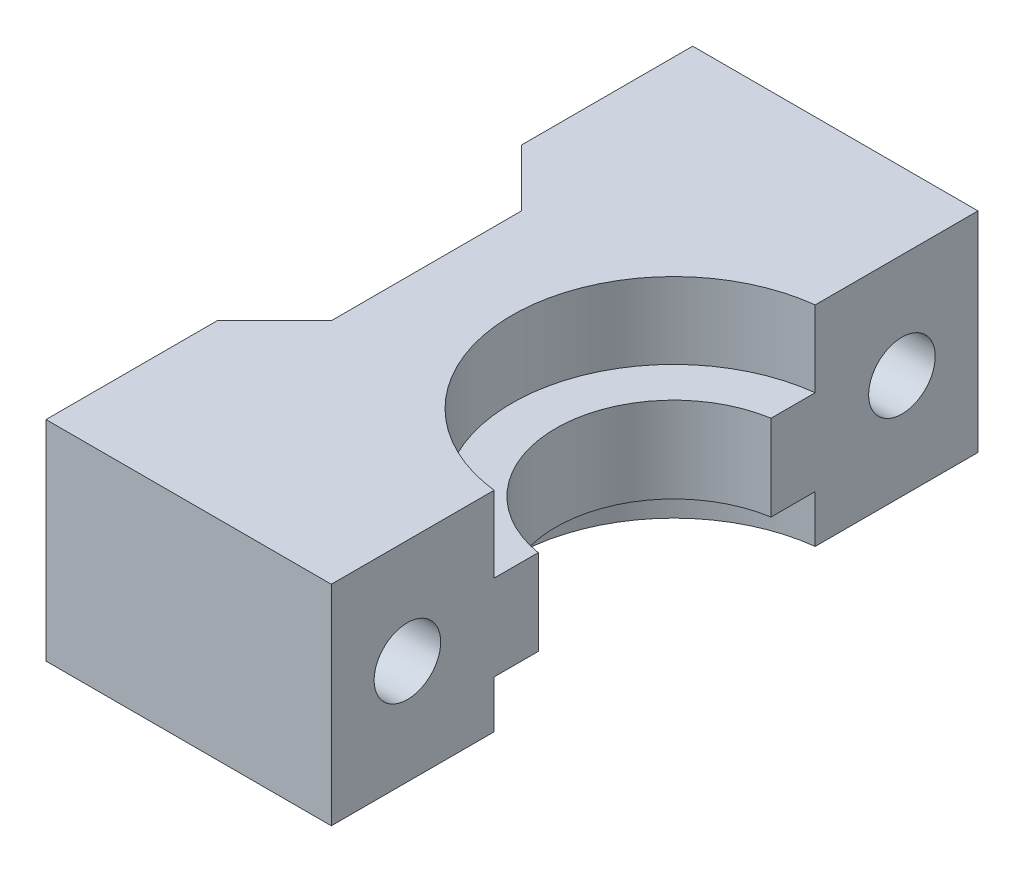
ISO-10303-21;
HEADER;
FILE_DESCRIPTION(('STEP AP214'),'2;1');
FILE_NAME('part.step','',(''),(''),'','','');
FILE_SCHEMA(('AUTOMOTIVE_DESIGN { 1 0 10303 214 1 1 1 1 }'));
ENDSEC;
DATA;
#1=APPLICATION_CONTEXT('core data for automotive mechanical design processes');
#2=APPLICATION_PROTOCOL_DEFINITION('international standard','automotive_design',2000,#1);
#3=PRODUCT_CONTEXT('',#1,'mechanical');
#4=PRODUCT('Part','Part','',(#3));
#5=PRODUCT_RELATED_PRODUCT_CATEGORY('part','',(#4));
#6=PRODUCT_DEFINITION_FORMATION('','',#4);
#7=PRODUCT_DEFINITION_CONTEXT('part definition',#1,'design');
#8=PRODUCT_DEFINITION('design','',#6,#7);
#9=PRODUCT_DEFINITION_SHAPE('','',#8);
#10=(LENGTH_UNIT() NAMED_UNIT(*) SI_UNIT(.MILLI.,.METRE.));
#11=(NAMED_UNIT(*) PLANE_ANGLE_UNIT() SI_UNIT($,.RADIAN.));
#12=(NAMED_UNIT(*) SI_UNIT($,.STERADIAN.) SOLID_ANGLE_UNIT());
#13=UNCERTAINTY_MEASURE_WITH_UNIT(LENGTH_MEASURE(1.E-05),#10,'distance_accuracy_value','');
#14=(GEOMETRIC_REPRESENTATION_CONTEXT(3) GLOBAL_UNCERTAINTY_ASSIGNED_CONTEXT((#13)) GLOBAL_UNIT_ASSIGNED_CONTEXT((#10,
#11,#12)) REPRESENTATION_CONTEXT('',''));
#15=CARTESIAN_POINT('',(0.,0.,0.));
#16=DIRECTION('',(0.,0.,1.));
#17=DIRECTION('',(1.,0.,0.));
#18=AXIS2_PLACEMENT_3D('',#15,#16,#17);
#19=CARTESIAN_POINT('',(-16.,0.,0.));
#20=DIRECTION('',(1.,0.,0.));
#21=DIRECTION('',(0.,0.,-1.));
#22=AXIS2_PLACEMENT_3D('',#19,#20,#21);
#23=PLANE('',#22);
#24=CARTESIAN_POINT('',(-16.,5.50000000000001,4.));
#25=DIRECTION('',(1.,0.,0.));
#26=DIRECTION('',(0.,0.,-1.));
#27=AXIS2_PLACEMENT_3D('',#24,#25,#26);
#28=CIRCLE('',#27,1.75);
#29=CARTESIAN_POINT('',(-16.,5.50000000000001,2.25));
#30=VERTEX_POINT('',#29);
#31=EDGE_CURVE('E221',#30,#30,#28,.T.);
#32=ORIENTED_EDGE('',*,*,#31,.T.);
#33=EDGE_LOOP('',(#32));
#34=FACE_BOUND('',#33,.T.);
#35=DIRECTION('',(0.,0.,-1.));
#36=VECTOR('',#35,1.);
#37=CARTESIAN_POINT('',(-16.,0.,34.));
#38=LINE('',#37,#36);
#39=CARTESIAN_POINT('',(-16.,0.,9.00000000000001));
#40=VERTEX_POINT('',#39);
#41=CARTESIAN_POINT('',(-16.,0.,0.));
#42=VERTEX_POINT('',#41);
#43=EDGE_CURVE('E230',#40,#42,#38,.T.);
#44=ORIENTED_EDGE('',*,*,#43,.F.);
#45=DIRECTION('',(0.,1.,0.));
#46=VECTOR('',#45,1.);
#47=CARTESIAN_POINT('',(-16.,0.,9.00000000000001));
#48=LINE('',#47,#46);
#49=CARTESIAN_POINT('',(-16.,11.,9.00000000000001));
#50=VERTEX_POINT('',#49);
#51=EDGE_CURVE('E13',#40,#50,#48,.T.);
#52=ORIENTED_EDGE('',*,*,#51,.T.);
#53=DIRECTION('',(0.,0.,1.));
#54=VECTOR('',#53,1.);
#55=CARTESIAN_POINT('',(-16.,11.,34.));
#56=LINE('',#55,#54);
#57=CARTESIAN_POINT('',(-16.,11.,0.));
#58=VERTEX_POINT('',#57);
#59=EDGE_CURVE('E236',#58,#50,#56,.T.);
#60=ORIENTED_EDGE('',*,*,#59,.F.);
#61=DIRECTION('',(0.,1.,0.));
#62=VECTOR('',#61,1.);
#63=CARTESIAN_POINT('',(-16.,11.,0.));
#64=LINE('',#63,#62);
#65=EDGE_CURVE('E232',#42,#58,#64,.T.);
#66=ORIENTED_EDGE('',*,*,#65,.F.);
#67=EDGE_LOOP('',(#44,#52,#60,#66));
#68=FACE_BOUND('',#67,.T.);
#69=ADVANCED_FACE('F47',(#34,#68),#23,.F.);
#70=CARTESIAN_POINT('',(-16.,11.,34.));
#71=DIRECTION('',(0.,0.,1.));
#72=DIRECTION('',(1.,0.,0.));
#73=AXIS2_PLACEMENT_3D('',#70,#71,#72);
#74=PLANE('',#73);
#75=DIRECTION('',(0.,1.,0.));
#76=VECTOR('',#75,1.);
#77=CARTESIAN_POINT('',(-0.999999999999997,0.,34.));
#78=LINE('',#77,#76);
#79=CARTESIAN_POINT('',(-0.999999999999997,0.,34.));
#80=VERTEX_POINT('',#79);
#81=CARTESIAN_POINT('',(-0.999999999999997,11.,34.));
#82=VERTEX_POINT('',#81);
#83=EDGE_CURVE('E179',#80,#82,#78,.T.);
#84=ORIENTED_EDGE('',*,*,#83,.T.);
#85=DIRECTION('',(1.,0.,0.));
#86=VECTOR('',#85,1.);
#87=CARTESIAN_POINT('',(-16.,11.,34.));
#88=LINE('',#87,#86);
#89=CARTESIAN_POINT('',(-16.,11.,34.));
#90=VERTEX_POINT('',#89);
#91=EDGE_CURVE('E240',#90,#82,#88,.T.);
#92=ORIENTED_EDGE('',*,*,#91,.F.);
#93=DIRECTION('',(0.,-1.,0.));
#94=VECTOR('',#93,1.);
#95=CARTESIAN_POINT('',(-16.,11.,34.));
#96=LINE('',#95,#94);
#97=CARTESIAN_POINT('',(-16.,0.,34.));
#98=VERTEX_POINT('',#97);
#99=EDGE_CURVE('E227',#90,#98,#96,.T.);
#100=ORIENTED_EDGE('',*,*,#99,.T.);
#101=DIRECTION('',(1.,0.,0.));
#102=VECTOR('',#101,1.);
#103=CARTESIAN_POINT('',(-16.,0.,34.));
#104=LINE('',#103,#102);
#105=EDGE_CURVE('E239',#98,#80,#104,.T.);
#106=ORIENTED_EDGE('',*,*,#105,.T.);
#107=EDGE_LOOP('',(#84,#92,#100,#106));
#108=FACE_BOUND('',#107,.T.);
#109=ADVANCED_FACE('F265',(#108),#74,.T.);
#110=CARTESIAN_POINT('',(-16.,11.,34.));
#111=DIRECTION('',(0.,1.,0.));
#112=DIRECTION('',(0.,0.,1.));
#113=AXIS2_PLACEMENT_3D('',#110,#111,#112);
#114=PLANE('',#113);
#115=DIRECTION('',(0.,0.,-1.));
#116=VECTOR('',#115,1.);
#117=CARTESIAN_POINT('',(-13.,11.,12.));
#118=LINE('',#117,#116);
#119=CARTESIAN_POINT('',(-13.,11.,22.));
#120=VERTEX_POINT('',#119);
#121=CARTESIAN_POINT('',(-13.,11.,12.));
#122=VERTEX_POINT('',#121);
#123=EDGE_CURVE('E163',#120,#122,#118,.T.);
#124=ORIENTED_EDGE('',*,*,#123,.F.);
#125=DIRECTION('',(0.707106781186546,0.,-0.707106781186549));
#126=VECTOR('',#125,1.);
#127=CARTESIAN_POINT('',(-20.5,11.,29.5));
#128=LINE('',#127,#126);
#129=CARTESIAN_POINT('',(-16.,11.,25.));
#130=VERTEX_POINT('',#129);
#131=EDGE_CURVE('E166',#120,#130,#128,.F.);
#132=ORIENTED_EDGE('',*,*,#131,.T.);
#133=EDGE_CURVE('E235',#130,#90,#56,.T.);
#134=ORIENTED_EDGE('',*,*,#133,.T.);
#135=ORIENTED_EDGE('',*,*,#91,.T.);
#136=DIRECTION('',(0.,0.,1.));
#137=VECTOR('',#136,1.);
#138=CARTESIAN_POINT('',(-1.,11.,0.));
#139=LINE('',#138,#137);
#140=CARTESIAN_POINT('',(-0.999999999999998,11.,25.4409715080671));
#141=VERTEX_POINT('',#140);
#142=EDGE_CURVE('E168',#141,#82,#139,.T.);
#143=ORIENTED_EDGE('',*,*,#142,.F.);
#144=CARTESIAN_POINT('',(0.,11.,17.));
#145=DIRECTION('',(0.,-1.,0.));
#146=DIRECTION('',(0.,0.,-1.));
#147=AXIS2_PLACEMENT_3D('',#144,#145,#146);
#148=CIRCLE('',#147,8.5);
#149=CARTESIAN_POINT('',(-1.,11.,8.55902849193294));
#150=VERTEX_POINT('',#149);
#151=EDGE_CURVE('E203',#141,#150,#148,.T.);
#152=ORIENTED_EDGE('',*,*,#151,.T.);
#153=CARTESIAN_POINT('',(-1.,11.,0.));
#154=VERTEX_POINT('',#153);
#155=EDGE_CURVE('E177',#154,#150,#139,.T.);
#156=ORIENTED_EDGE('',*,*,#155,.F.);
#157=DIRECTION('',(1.,0.,0.));
#158=VECTOR('',#157,1.);
#159=CARTESIAN_POINT('',(-16.,11.,0.));
#160=LINE('',#159,#158);
#161=EDGE_CURVE('E244',#58,#154,#160,.T.);
#162=ORIENTED_EDGE('',*,*,#161,.F.);
#163=ORIENTED_EDGE('',*,*,#59,.T.);
#164=DIRECTION('',(-0.707106781186549,0.,-0.707106781186546));
#165=VECTOR('',#164,1.);
#166=CARTESIAN_POINT('',(-3.5,11.,21.5));
#167=LINE('',#166,#165);
#168=EDGE_CURVE('E255',#50,#122,#167,.F.);
#169=ORIENTED_EDGE('',*,*,#168,.T.);
#170=EDGE_LOOP('',(#124,#132,#134,#135,#143,#152,#156,#162,#163,#169));
#171=FACE_BOUND('',#170,.T.);
#172=ADVANCED_FACE('F260',(#171),#114,.T.);
#173=CARTESIAN_POINT('',(-16.,11.,0.));
#174=DIRECTION('',(0.,0.,-1.));
#175=DIRECTION('',(0.,1.,0.));
#176=AXIS2_PLACEMENT_3D('',#173,#174,#175);
#177=PLANE('',#176);
#178=DIRECTION('',(0.,1.,0.));
#179=VECTOR('',#178,1.);
#180=CARTESIAN_POINT('',(-1.,0.,0.));
#181=LINE('',#180,#179);
#182=CARTESIAN_POINT('',(-1.,0.,0.));
#183=VERTEX_POINT('',#182);
#184=EDGE_CURVE('E175',#183,#154,#181,.T.);
#185=ORIENTED_EDGE('',*,*,#184,.F.);
#186=DIRECTION('',(1.,0.,0.));
#187=VECTOR('',#186,1.);
#188=CARTESIAN_POINT('',(-16.,0.,0.));
#189=LINE('',#188,#187);
#190=EDGE_CURVE('E247',#42,#183,#189,.T.);
#191=ORIENTED_EDGE('',*,*,#190,.F.);
#192=ORIENTED_EDGE('',*,*,#65,.T.);
#193=ORIENTED_EDGE('',*,*,#161,.T.);
#194=EDGE_LOOP('',(#185,#191,#192,#193));
#195=FACE_BOUND('',#194,.T.);
#196=ADVANCED_FACE('F303',(#195),#177,.T.);
#197=CARTESIAN_POINT('',(-16.,0.,34.));
#198=DIRECTION('',(0.,-1.,0.));
#199=DIRECTION('',(0.,0.,-1.));
#200=AXIS2_PLACEMENT_3D('',#197,#198,#199);
#201=PLANE('',#200);
#202=CARTESIAN_POINT('',(-16.,0.,25.));
#203=VERTEX_POINT('',#202);
#204=EDGE_CURVE('E152',#98,#203,#38,.T.);
#205=ORIENTED_EDGE('',*,*,#204,.T.);
#206=DIRECTION('',(-0.707106781186546,0.,0.707106781186549));
#207=VECTOR('',#206,1.);
#208=CARTESIAN_POINT('',(-20.5,0.,29.5));
#209=LINE('',#208,#207);
#210=CARTESIAN_POINT('',(-13.,0.,22.));
#211=VERTEX_POINT('',#210);
#212=EDGE_CURVE('E55',#203,#211,#209,.F.);
#213=ORIENTED_EDGE('',*,*,#212,.T.);
#214=DIRECTION('',(0.,0.,-1.));
#215=VECTOR('',#214,1.);
#216=CARTESIAN_POINT('',(-13.,0.,12.));
#217=LINE('',#216,#215);
#218=CARTESIAN_POINT('',(-13.,0.,12.));
#219=VERTEX_POINT('',#218);
#220=EDGE_CURVE('E151',#211,#219,#217,.T.);
#221=ORIENTED_EDGE('',*,*,#220,.T.);
#222=DIRECTION('',(0.707106781186549,0.,0.707106781186546));
#223=VECTOR('',#222,1.);
#224=CARTESIAN_POINT('',(-3.5,0.,21.5));
#225=LINE('',#224,#223);
#226=EDGE_CURVE('E62',#219,#40,#225,.F.);
#227=ORIENTED_EDGE('',*,*,#226,.T.);
#228=ORIENTED_EDGE('',*,*,#43,.T.);
#229=ORIENTED_EDGE('',*,*,#190,.T.);
#230=DIRECTION('',(0.,0.,1.));
#231=VECTOR('',#230,1.);
#232=CARTESIAN_POINT('',(-1.,0.,0.));
#233=LINE('',#232,#231);
#234=CARTESIAN_POINT('',(-0.999999999999999,0.,8.55902849193294));
#235=VERTEX_POINT('',#234);
#236=EDGE_CURVE('E172',#183,#235,#233,.T.);
#237=ORIENTED_EDGE('',*,*,#236,.T.);
#238=CARTESIAN_POINT('',(0.,0.,17.));
#239=DIRECTION('',(0.,-1.,0.));
#240=DIRECTION('',(0.,0.,-1.));
#241=AXIS2_PLACEMENT_3D('',#238,#239,#240);
#242=CIRCLE('',#241,8.5);
#243=CARTESIAN_POINT('',(-0.999999999999998,0.,25.4409715080671));
#244=VERTEX_POINT('',#243);
#245=EDGE_CURVE('E218',#244,#235,#242,.T.);
#246=ORIENTED_EDGE('',*,*,#245,.F.);
#247=EDGE_CURVE('E176',#244,#80,#233,.T.);
#248=ORIENTED_EDGE('',*,*,#247,.T.);
#249=ORIENTED_EDGE('',*,*,#105,.F.);
#250=EDGE_LOOP('',(#205,#213,#221,#227,#228,#229,#237,#246,#248,#249));
#251=FACE_BOUND('',#250,.T.);
#252=ADVANCED_FACE('F150',(#251),#201,.T.);
#253=CARTESIAN_POINT('',(-16.,5.5,30.));
#254=DIRECTION('',(1.,0.,0.));
#255=DIRECTION('',(0.,0.,-1.));
#256=AXIS2_PLACEMENT_3D('',#253,#254,#255);
#257=CIRCLE('',#256,1.75);
#258=CARTESIAN_POINT('',(-16.,5.5,28.25));
#259=VERTEX_POINT('',#258);
#260=EDGE_CURVE('E224',#259,#259,#257,.T.);
#261=ORIENTED_EDGE('',*,*,#260,.T.);
#262=EDGE_LOOP('',(#261));
#263=FACE_BOUND('',#262,.T.);
#264=ORIENTED_EDGE('',*,*,#133,.F.);
#265=DIRECTION('',(0.,-1.,0.));
#266=VECTOR('',#265,1.);
#267=CARTESIAN_POINT('',(-16.,0.,25.));
#268=LINE('',#267,#266);
#269=EDGE_CURVE('E70',#130,#203,#268,.T.);
#270=ORIENTED_EDGE('',*,*,#269,.T.);
#271=ORIENTED_EDGE('',*,*,#204,.F.);
#272=ORIENTED_EDGE('',*,*,#99,.F.);
#273=EDGE_LOOP('',(#264,#270,#271,#272));
#274=FACE_BOUND('',#273,.T.);
#275=ADVANCED_FACE('F263',(#263,#274),#23,.F.);
#276=CARTESIAN_POINT('',(-16.,5.5,30.));
#277=DIRECTION('',(1.,0.,0.));
#278=DIRECTION('',(0.,0.,-1.));
#279=AXIS2_PLACEMENT_3D('',#276,#277,#278);
#280=CYLINDRICAL_SURFACE('',#279,1.75);
#281=CARTESIAN_POINT('',(-0.999999999999999,5.5,30.));
#282=DIRECTION('',(-1.,0.,0.));
#283=DIRECTION('',(0.,0.,1.));
#284=AXIS2_PLACEMENT_3D('',#281,#282,#283);
#285=CIRCLE('',#284,1.75);
#286=CARTESIAN_POINT('',(-0.999999999999999,5.5,31.75));
#287=VERTEX_POINT('',#286);
#288=EDGE_CURVE('E200',#287,#287,#285,.F.);
#289=ORIENTED_EDGE('',*,*,#288,.T.);
#290=EDGE_LOOP('',(#289));
#291=FACE_BOUND('',#290,.T.);
#292=ORIENTED_EDGE('',*,*,#260,.F.);
#293=EDGE_LOOP('',(#292));
#294=FACE_BOUND('',#293,.T.);
#295=ADVANCED_FACE('F322',(#291,#294),#280,.F.);
#296=CARTESIAN_POINT('',(-16.,5.50000000000001,4.));
#297=DIRECTION('',(1.,0.,0.));
#298=DIRECTION('',(0.,0.,-1.));
#299=AXIS2_PLACEMENT_3D('',#296,#297,#298);
#300=CYLINDRICAL_SURFACE('',#299,1.75);
#301=CARTESIAN_POINT('',(-1.,5.50000000000001,4.));
#302=DIRECTION('',(-1.,0.,0.));
#303=DIRECTION('',(0.,0.,1.));
#304=AXIS2_PLACEMENT_3D('',#301,#302,#303);
#305=CIRCLE('',#304,1.75);
#306=CARTESIAN_POINT('',(-1.,5.50000000000001,5.75));
#307=VERTEX_POINT('',#306);
#308=EDGE_CURVE('E197',#307,#307,#305,.F.);
#309=ORIENTED_EDGE('',*,*,#308,.T.);
#310=EDGE_LOOP('',(#309));
#311=FACE_BOUND('',#310,.T.);
#312=ORIENTED_EDGE('',*,*,#31,.F.);
#313=EDGE_LOOP('',(#312));
#314=FACE_BOUND('',#313,.T.);
#315=ADVANCED_FACE('F328',(#311,#314),#300,.F.);
#316=CARTESIAN_POINT('',(0.,0.,17.));
#317=DIRECTION('',(0.,-1.,0.));
#318=DIRECTION('',(0.,0.,-1.));
#319=AXIS2_PLACEMENT_3D('',#316,#317,#318);
#320=CYLINDRICAL_SURFACE('',#319,8.49999999999999);
#321=DIRECTION('',(0.,-1.,0.));
#322=VECTOR('',#321,1.);
#323=CARTESIAN_POINT('',(-0.999999999999999,0.,8.55902849193294));
#324=LINE('',#323,#322);
#325=CARTESIAN_POINT('',(-0.999999999999999,2.5,8.55902849193295));
#326=VERTEX_POINT('',#325);
#327=EDGE_CURVE('E195',#326,#235,#324,.T.);
#328=ORIENTED_EDGE('',*,*,#327,.F.);
#329=CARTESIAN_POINT('',(0.,2.5,17.));
#330=DIRECTION('',(0.,-1.,0.));
#331=DIRECTION('',(0.,0.,-1.));
#332=AXIS2_PLACEMENT_3D('',#329,#330,#331);
#333=CIRCLE('',#332,8.49999999999999);
#334=CARTESIAN_POINT('',(-0.999999999999998,2.5,25.4409715080671));
#335=VERTEX_POINT('',#334);
#336=EDGE_CURVE('E215',#335,#326,#333,.T.);
#337=ORIENTED_EDGE('',*,*,#336,.F.);
#338=DIRECTION('',(0.,-1.,0.));
#339=VECTOR('',#338,1.);
#340=CARTESIAN_POINT('',(-0.999999999999998,0.,25.4409715080671));
#341=LINE('',#340,#339);
#342=EDGE_CURVE('E190',#244,#335,#341,.F.);
#343=ORIENTED_EDGE('',*,*,#342,.F.);
#344=ORIENTED_EDGE('',*,*,#245,.T.);
#345=EDGE_LOOP('',(#328,#337,#343,#344));
#346=FACE_BOUND('',#345,.T.);
#347=ADVANCED_FACE('F296',(#346),#320,.F.);
#348=CARTESIAN_POINT('',(0.,2.50000000000001,23.2));
#349=DIRECTION('',(0.,-1.,0.));
#350=DIRECTION('',(0.,0.,-1.));
#351=AXIS2_PLACEMENT_3D('',#348,#349,#350);
#352=PLANE('',#351);
#353=DIRECTION('',(0.,0.,-1.));
#354=VECTOR('',#353,1.);
#355=CARTESIAN_POINT('',(-0.999999999999998,2.50000000000001,23.2));
#356=LINE('',#355,#354);
#357=CARTESIAN_POINT('',(-0.999999999999998,2.50000000000001,23.1188234163114));
#358=VERTEX_POINT('',#357);
#359=EDGE_CURVE('E188',#335,#358,#356,.T.);
#360=ORIENTED_EDGE('',*,*,#359,.F.);
#361=ORIENTED_EDGE('',*,*,#336,.T.);
#362=CARTESIAN_POINT('',(-0.999999999999999,2.50000000000001,10.8811765836887));
#363=VERTEX_POINT('',#362);
#364=EDGE_CURVE('E191',#363,#326,#356,.T.);
#365=ORIENTED_EDGE('',*,*,#364,.F.);
#366=CARTESIAN_POINT('',(0.,2.50000000000001,17.));
#367=DIRECTION('',(0.,-1.,0.));
#368=DIRECTION('',(0.,0.,-1.));
#369=AXIS2_PLACEMENT_3D('',#366,#367,#368);
#370=CIRCLE('',#369,6.2);
#371=EDGE_CURVE('E212',#358,#363,#370,.T.);
#372=ORIENTED_EDGE('',*,*,#371,.F.);
#373=EDGE_LOOP('',(#360,#361,#365,#372));
#374=FACE_BOUND('',#373,.T.);
#375=ADVANCED_FACE('F292',(#374),#352,.T.);
#376=CARTESIAN_POINT('',(0.,0.,17.));
#377=DIRECTION('',(0.,-1.,0.));
#378=DIRECTION('',(0.,0.,-1.));
#379=AXIS2_PLACEMENT_3D('',#376,#377,#378);
#380=CYLINDRICAL_SURFACE('',#379,6.2);
#381=DIRECTION('',(0.,-1.,0.));
#382=VECTOR('',#381,1.);
#383=CARTESIAN_POINT('',(-0.999999999999999,0.,10.8811765836887));
#384=LINE('',#383,#382);
#385=CARTESIAN_POINT('',(-0.999999999999999,7.00000000000001,10.8811765836887));
#386=VERTEX_POINT('',#385);
#387=EDGE_CURVE('E193',#386,#363,#384,.T.);
#388=ORIENTED_EDGE('',*,*,#387,.F.);
#389=CARTESIAN_POINT('',(0.,7.00000000000001,17.));
#390=DIRECTION('',(0.,-1.,0.));
#391=DIRECTION('',(0.,0.,-1.));
#392=AXIS2_PLACEMENT_3D('',#389,#390,#391);
#393=CIRCLE('',#392,6.2);
#394=CARTESIAN_POINT('',(-0.999999999999998,7.00000000000001,23.1188234163113));
#395=VERTEX_POINT('',#394);
#396=EDGE_CURVE('E209',#395,#386,#393,.T.);
#397=ORIENTED_EDGE('',*,*,#396,.F.);
#398=DIRECTION('',(0.,-1.,0.));
#399=VECTOR('',#398,1.);
#400=CARTESIAN_POINT('',(-0.999999999999998,0.,23.1188234163114));
#401=LINE('',#400,#399);
#402=EDGE_CURVE('E185',#358,#395,#401,.F.);
#403=ORIENTED_EDGE('',*,*,#402,.F.);
#404=ORIENTED_EDGE('',*,*,#371,.T.);
#405=EDGE_LOOP('',(#388,#397,#403,#404));
#406=FACE_BOUND('',#405,.T.);
#407=ADVANCED_FACE('F286',(#406),#380,.F.);
#408=CARTESIAN_POINT('',(0.,7.,23.2));
#409=DIRECTION('',(0.,1.,0.));
#410=DIRECTION('',(0.,0.,1.));
#411=AXIS2_PLACEMENT_3D('',#408,#409,#410);
#412=PLANE('',#411);
#413=DIRECTION('',(0.,0.,1.));
#414=VECTOR('',#413,1.);
#415=CARTESIAN_POINT('',(-0.999999999999998,7.,23.2));
#416=LINE('',#415,#414);
#417=CARTESIAN_POINT('',(-0.999999999999999,7.,8.55902849193294));
#418=VERTEX_POINT('',#417);
#419=EDGE_CURVE('E186',#418,#386,#416,.T.);
#420=ORIENTED_EDGE('',*,*,#419,.F.);
#421=CARTESIAN_POINT('',(0.,7.,17.));
#422=DIRECTION('',(0.,-1.,0.));
#423=DIRECTION('',(0.,0.,-1.));
#424=AXIS2_PLACEMENT_3D('',#421,#422,#423);
#425=CIRCLE('',#424,8.5);
#426=CARTESIAN_POINT('',(-0.999999999999998,7.,25.4409715080671));
#427=VERTEX_POINT('',#426);
#428=EDGE_CURVE('E206',#427,#418,#425,.T.);
#429=ORIENTED_EDGE('',*,*,#428,.F.);
#430=EDGE_CURVE('E182',#395,#427,#416,.T.);
#431=ORIENTED_EDGE('',*,*,#430,.F.);
#432=ORIENTED_EDGE('',*,*,#396,.T.);
#433=EDGE_LOOP('',(#420,#429,#431,#432));
#434=FACE_BOUND('',#433,.T.);
#435=ADVANCED_FACE('F281',(#434),#412,.T.);
#436=CARTESIAN_POINT('',(0.,0.,17.));
#437=DIRECTION('',(0.,-1.,0.));
#438=DIRECTION('',(0.,0.,-1.));
#439=AXIS2_PLACEMENT_3D('',#436,#437,#438);
#440=CYLINDRICAL_SURFACE('',#439,8.5);
#441=DIRECTION('',(0.,-1.,0.));
#442=VECTOR('',#441,1.);
#443=CARTESIAN_POINT('',(-0.999999999999999,0.,8.55902849193294));
#444=LINE('',#443,#442);
#445=EDGE_CURVE('E253',#150,#418,#444,.T.);
#446=ORIENTED_EDGE('',*,*,#445,.F.);
#447=ORIENTED_EDGE('',*,*,#151,.F.);
#448=DIRECTION('',(0.,-1.,0.));
#449=VECTOR('',#448,1.);
#450=CARTESIAN_POINT('',(-0.999999999999998,0.,25.4409715080671));
#451=LINE('',#450,#449);
#452=EDGE_CURVE('E243',#427,#141,#451,.F.);
#453=ORIENTED_EDGE('',*,*,#452,.F.);
#454=ORIENTED_EDGE('',*,*,#428,.T.);
#455=EDGE_LOOP('',(#446,#447,#453,#454));
#456=FACE_BOUND('',#455,.T.);
#457=ADVANCED_FACE('F273',(#456),#440,.F.);
#458=CARTESIAN_POINT('',(-1.,0.,0.));
#459=DIRECTION('',(-1.,0.,0.));
#460=DIRECTION('',(0.,0.,1.));
#461=AXIS2_PLACEMENT_3D('',#458,#459,#460);
#462=PLANE('',#461);
#463=ORIENTED_EDGE('',*,*,#342,.T.);
#464=ORIENTED_EDGE('',*,*,#359,.T.);
#465=ORIENTED_EDGE('',*,*,#402,.T.);
#466=ORIENTED_EDGE('',*,*,#430,.T.);
#467=ORIENTED_EDGE('',*,*,#452,.T.);
#468=ORIENTED_EDGE('',*,*,#142,.T.);
#469=ORIENTED_EDGE('',*,*,#83,.F.);
#470=ORIENTED_EDGE('',*,*,#247,.F.);
#471=EDGE_LOOP('',(#463,#464,#465,#466,#467,#468,#469,#470));
#472=FACE_BOUND('',#471,.T.);
#473=ORIENTED_EDGE('',*,*,#288,.F.);
#474=EDGE_LOOP('',(#473));
#475=FACE_BOUND('',#474,.T.);
#476=ADVANCED_FACE('F406',(#472,#475),#462,.F.);
#477=ORIENTED_EDGE('',*,*,#327,.T.);
#478=ORIENTED_EDGE('',*,*,#236,.F.);
#479=ORIENTED_EDGE('',*,*,#184,.T.);
#480=ORIENTED_EDGE('',*,*,#155,.T.);
#481=ORIENTED_EDGE('',*,*,#445,.T.);
#482=ORIENTED_EDGE('',*,*,#419,.T.);
#483=ORIENTED_EDGE('',*,*,#387,.T.);
#484=ORIENTED_EDGE('',*,*,#364,.T.);
#485=EDGE_LOOP('',(#477,#478,#479,#480,#481,#482,#483,#484));
#486=FACE_BOUND('',#485,.T.);
#487=ORIENTED_EDGE('',*,*,#308,.F.);
#488=EDGE_LOOP('',(#487));
#489=FACE_BOUND('',#488,.T.);
#490=ADVANCED_FACE('F277',(#486,#489),#462,.F.);
#491=CARTESIAN_POINT('',(-13.,0.,12.));
#492=DIRECTION('',(1.,0.,0.));
#493=DIRECTION('',(0.,0.,-1.));
#494=AXIS2_PLACEMENT_3D('',#491,#492,#493);
#495=PLANE('',#494);
#496=ORIENTED_EDGE('',*,*,#123,.T.);
#497=DIRECTION('',(0.,1.,0.));
#498=VECTOR('',#497,1.);
#499=CARTESIAN_POINT('',(-13.,0.,12.));
#500=LINE('',#499,#498);
#501=EDGE_CURVE('E162',#219,#122,#500,.T.);
#502=ORIENTED_EDGE('',*,*,#501,.F.);
#503=ORIENTED_EDGE('',*,*,#220,.F.);
#504=DIRECTION('',(0.,1.,0.));
#505=VECTOR('',#504,1.);
#506=CARTESIAN_POINT('',(-13.,0.,22.));
#507=LINE('',#506,#505);
#508=EDGE_CURVE('E159',#211,#120,#507,.T.);
#509=ORIENTED_EDGE('',*,*,#508,.T.);
#510=EDGE_LOOP('',(#496,#502,#503,#509));
#511=FACE_BOUND('',#510,.T.);
#512=ADVANCED_FACE('F158',(#511),#495,.F.);
#513=CARTESIAN_POINT('',(-13.,0.,22.));
#514=DIRECTION('',(0.707106781186549,0.,0.707106781186546));
#515=DIRECTION('',(0.,1.,0.));
#516=AXIS2_PLACEMENT_3D('',#513,#514,#515);
#517=PLANE('',#516);
#518=ORIENTED_EDGE('',*,*,#212,.F.);
#519=ORIENTED_EDGE('',*,*,#269,.F.);
#520=ORIENTED_EDGE('',*,*,#131,.F.);
#521=ORIENTED_EDGE('',*,*,#508,.F.);
#522=EDGE_LOOP('',(#518,#519,#520,#521));
#523=FACE_BOUND('',#522,.T.);
#524=ADVANCED_FACE('F165',(#523),#517,.F.);
#525=CARTESIAN_POINT('',(-16.,0.,9.00000000000001));
#526=DIRECTION('',(0.707106781186546,0.,-0.707106781186549));
#527=DIRECTION('',(0.,1.,0.));
#528=AXIS2_PLACEMENT_3D('',#525,#526,#527);
#529=PLANE('',#528);
#530=ORIENTED_EDGE('',*,*,#226,.F.);
#531=ORIENTED_EDGE('',*,*,#501,.T.);
#532=ORIENTED_EDGE('',*,*,#168,.F.);
#533=ORIENTED_EDGE('',*,*,#51,.F.);
#534=EDGE_LOOP('',(#530,#531,#532,#533));
#535=FACE_BOUND('',#534,.T.);
#536=ADVANCED_FACE('F49',(#535),#529,.F.);
#537=CLOSED_SHELL('',(#69,#109,#172,#196,#252,#275,#295,#315,#347,#375,#407,#435,#457,#476,#490,
#512,#524,#536));
#538=MANIFOLD_SOLID_BREP('B2',#537);
#539=ADVANCED_BREP_SHAPE_REPRESENTATION('',(#18,#538),#14);
#540=SHAPE_DEFINITION_REPRESENTATION(#9,#539);
ENDSEC;
END-ISO-10303-21;
